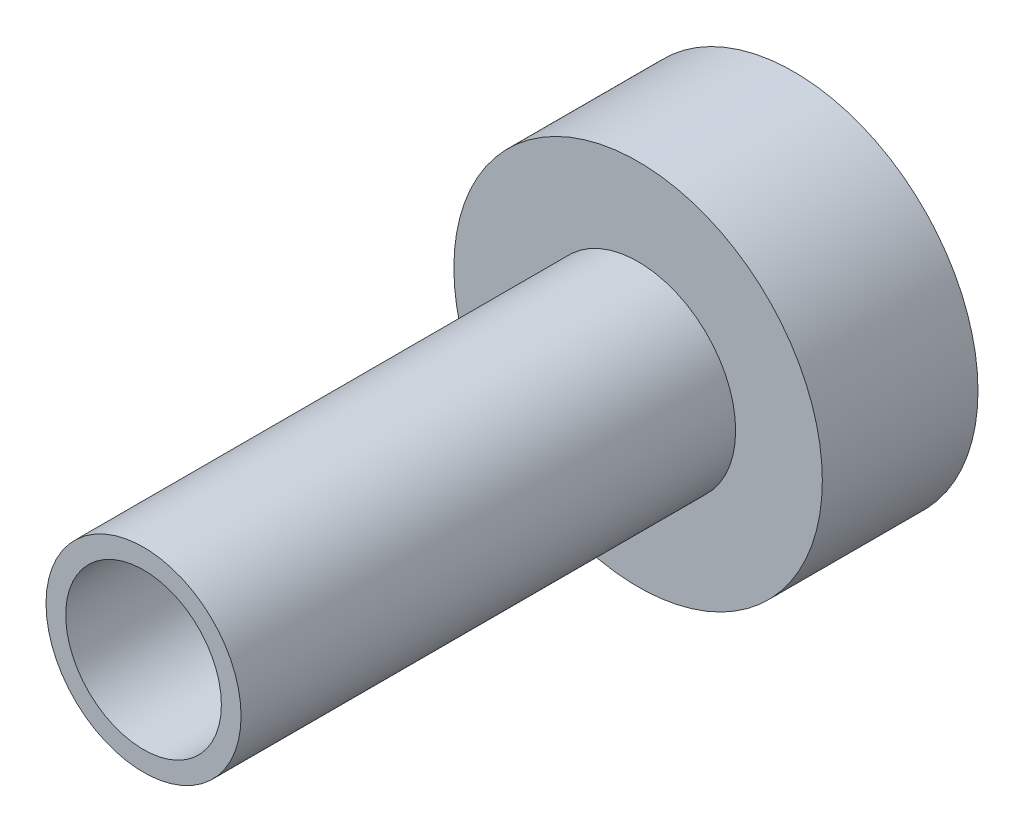
ISO-10303-21;
HEADER;
FILE_DESCRIPTION(('STEP AP214'),'2;1');
FILE_NAME('part.step','',(''),(''),'','','');
FILE_SCHEMA(('AUTOMOTIVE_DESIGN { 1 0 10303 214 1 1 1 1 }'));
ENDSEC;
DATA;
#1=APPLICATION_CONTEXT('core data for automotive mechanical design processes');
#2=APPLICATION_PROTOCOL_DEFINITION('international standard','automotive_design',2000,#1);
#3=PRODUCT_CONTEXT('',#1,'mechanical');
#4=PRODUCT('Part','Part','',(#3));
#5=PRODUCT_RELATED_PRODUCT_CATEGORY('part','',(#4));
#6=PRODUCT_DEFINITION_FORMATION('','',#4);
#7=PRODUCT_DEFINITION_CONTEXT('part definition',#1,'design');
#8=PRODUCT_DEFINITION('design','',#6,#7);
#9=PRODUCT_DEFINITION_SHAPE('','',#8);
#10=(LENGTH_UNIT() NAMED_UNIT(*) SI_UNIT(.MILLI.,.METRE.));
#11=(NAMED_UNIT(*) PLANE_ANGLE_UNIT() SI_UNIT($,.RADIAN.));
#12=(NAMED_UNIT(*) SI_UNIT($,.STERADIAN.) SOLID_ANGLE_UNIT());
#13=UNCERTAINTY_MEASURE_WITH_UNIT(LENGTH_MEASURE(1.E-05),#10,'distance_accuracy_value','');
#14=(GEOMETRIC_REPRESENTATION_CONTEXT(3) GLOBAL_UNCERTAINTY_ASSIGNED_CONTEXT((#13)) GLOBAL_UNIT_ASSIGNED_CONTEXT((#10,
#11,#12)) REPRESENTATION_CONTEXT('',''));
#15=CARTESIAN_POINT('',(0.,0.,0.));
#16=DIRECTION('',(0.,0.,1.));
#17=DIRECTION('',(1.,0.,0.));
#18=AXIS2_PLACEMENT_3D('',#15,#16,#17);
#19=CARTESIAN_POINT('',(0.,0.,33.));
#20=DIRECTION('',(0.,0.,1.));
#21=DIRECTION('',(1.,0.,0.));
#22=AXIS2_PLACEMENT_3D('',#19,#20,#21);
#23=PLANE('',#22);
#24=CARTESIAN_POINT('',(0.,0.,33.));
#25=DIRECTION('',(0.,0.,1.));
#26=DIRECTION('',(1.,0.,0.));
#27=AXIS2_PLACEMENT_3D('',#24,#25,#26);
#28=CIRCLE('',#27,3.95);
#29=CARTESIAN_POINT('',(3.95,0.,33.));
#30=VERTEX_POINT('',#29);
#31=EDGE_CURVE('E38',#30,#30,#28,.T.);
#32=ORIENTED_EDGE('',*,*,#31,.F.);
#33=EDGE_LOOP('',(#32));
#34=FACE_BOUND('',#33,.T.);
#35=CARTESIAN_POINT('',(0.,0.,33.));
#36=DIRECTION('',(0.,0.,1.));
#37=DIRECTION('',(1.,0.,0.));
#38=AXIS2_PLACEMENT_3D('',#35,#36,#37);
#39=CIRCLE('',#38,4.95);
#40=CARTESIAN_POINT('',(4.95,0.,33.));
#41=VERTEX_POINT('',#40);
#42=EDGE_CURVE('E52',#41,#41,#39,.T.);
#43=ORIENTED_EDGE('',*,*,#42,.T.);
#44=EDGE_LOOP('',(#43));
#45=FACE_BOUND('',#44,.T.);
#46=ADVANCED_FACE('F31',(#34,#45),#23,.T.);
#47=CARTESIAN_POINT('',(0.,0.,33.));
#48=DIRECTION('',(0.,0.,-1.));
#49=DIRECTION('',(-1.,0.,0.));
#50=AXIS2_PLACEMENT_3D('',#47,#48,#49);
#51=CYLINDRICAL_SURFACE('',#50,9.35);
#52=CARTESIAN_POINT('',(0.,0.,0.));
#53=DIRECTION('',(0.,0.,1.));
#54=DIRECTION('',(1.,0.,0.));
#55=AXIS2_PLACEMENT_3D('',#52,#53,#54);
#56=CIRCLE('',#55,9.35);
#57=CARTESIAN_POINT('',(9.35,0.,0.));
#58=VERTEX_POINT('',#57);
#59=EDGE_CURVE('E10',#58,#58,#56,.T.);
#60=ORIENTED_EDGE('',*,*,#59,.T.);
#61=EDGE_LOOP('',(#60));
#62=FACE_BOUND('',#61,.T.);
#63=CARTESIAN_POINT('',(0.,0.,7.9));
#64=DIRECTION('',(0.,0.,1.));
#65=DIRECTION('',(1.,0.,0.));
#66=AXIS2_PLACEMENT_3D('',#63,#64,#65);
#67=CIRCLE('',#66,9.35);
#68=CARTESIAN_POINT('',(9.35,0.,7.9));
#69=VERTEX_POINT('',#68);
#70=EDGE_CURVE('E47',#69,#69,#67,.T.);
#71=ORIENTED_EDGE('',*,*,#70,.F.);
#72=EDGE_LOOP('',(#71));
#73=FACE_BOUND('',#72,.T.);
#74=ADVANCED_FACE('F33',(#62,#73),#51,.T.);
#75=CARTESIAN_POINT('',(0.,0.,0.));
#76=DIRECTION('',(0.,0.,1.));
#77=DIRECTION('',(1.,0.,0.));
#78=AXIS2_PLACEMENT_3D('',#75,#76,#77);
#79=PLANE('',#78);
#80=ORIENTED_EDGE('',*,*,#59,.F.);
#81=EDGE_LOOP('',(#80));
#82=FACE_BOUND('',#81,.T.);
#83=CARTESIAN_POINT('',(0.,0.,0.));
#84=DIRECTION('',(0.,0.,1.));
#85=DIRECTION('',(1.,0.,0.));
#86=AXIS2_PLACEMENT_3D('',#83,#84,#85);
#87=CIRCLE('',#86,3.95);
#88=CARTESIAN_POINT('',(3.95,0.,0.));
#89=VERTEX_POINT('',#88);
#90=EDGE_CURVE('E42',#89,#89,#87,.T.);
#91=ORIENTED_EDGE('',*,*,#90,.T.);
#92=EDGE_LOOP('',(#91));
#93=FACE_BOUND('',#92,.T.);
#94=ADVANCED_FACE('F69',(#82,#93),#79,.F.);
#95=CARTESIAN_POINT('',(0.,0.,33.));
#96=DIRECTION('',(0.,0.,-1.));
#97=DIRECTION('',(-1.,0.,0.));
#98=AXIS2_PLACEMENT_3D('',#95,#96,#97);
#99=CYLINDRICAL_SURFACE('',#98,3.95);
#100=ORIENTED_EDGE('',*,*,#31,.T.);
#101=EDGE_LOOP('',(#100));
#102=FACE_BOUND('',#101,.T.);
#103=ORIENTED_EDGE('',*,*,#90,.F.);
#104=EDGE_LOOP('',(#103));
#105=FACE_BOUND('',#104,.T.);
#106=ADVANCED_FACE('F64',(#102,#105),#99,.F.);
#107=CARTESIAN_POINT('',(0.,0.,7.9));
#108=DIRECTION('',(0.,0.,1.));
#109=DIRECTION('',(1.,0.,0.));
#110=AXIS2_PLACEMENT_3D('',#107,#108,#109);
#111=PLANE('',#110);
#112=CARTESIAN_POINT('',(0.,0.,7.9));
#113=DIRECTION('',(0.,0.,1.));
#114=DIRECTION('',(1.,0.,0.));
#115=AXIS2_PLACEMENT_3D('',#112,#113,#114);
#116=CIRCLE('',#115,4.95);
#117=CARTESIAN_POINT('',(4.95,0.,7.9));
#118=VERTEX_POINT('',#117);
#119=EDGE_CURVE('E51',#118,#118,#116,.T.);
#120=ORIENTED_EDGE('',*,*,#119,.F.);
#121=EDGE_LOOP('',(#120));
#122=FACE_BOUND('',#121,.T.);
#123=ORIENTED_EDGE('',*,*,#70,.T.);
#124=EDGE_LOOP('',(#123));
#125=FACE_BOUND('',#124,.T.);
#126=ADVANCED_FACE('F61',(#122,#125),#111,.T.);
#127=CARTESIAN_POINT('',(0.,0.,7.9));
#128=DIRECTION('',(0.,0.,1.));
#129=DIRECTION('',(1.,0.,0.));
#130=AXIS2_PLACEMENT_3D('',#127,#128,#129);
#131=CYLINDRICAL_SURFACE('',#130,4.95);
#132=ORIENTED_EDGE('',*,*,#119,.T.);
#133=EDGE_LOOP('',(#132));
#134=FACE_BOUND('',#133,.T.);
#135=ORIENTED_EDGE('',*,*,#42,.F.);
#136=EDGE_LOOP('',(#135));
#137=FACE_BOUND('',#136,.T.);
#138=ADVANCED_FACE('F58',(#134,#137),#131,.T.);
#139=CLOSED_SHELL('',(#46,#74,#94,#106,#126,#138));
#140=MANIFOLD_SOLID_BREP('B2',#139);
#141=ADVANCED_BREP_SHAPE_REPRESENTATION('',(#18,#140),#14);
#142=SHAPE_DEFINITION_REPRESENTATION(#9,#141);
ENDSEC;
END-ISO-10303-21;
